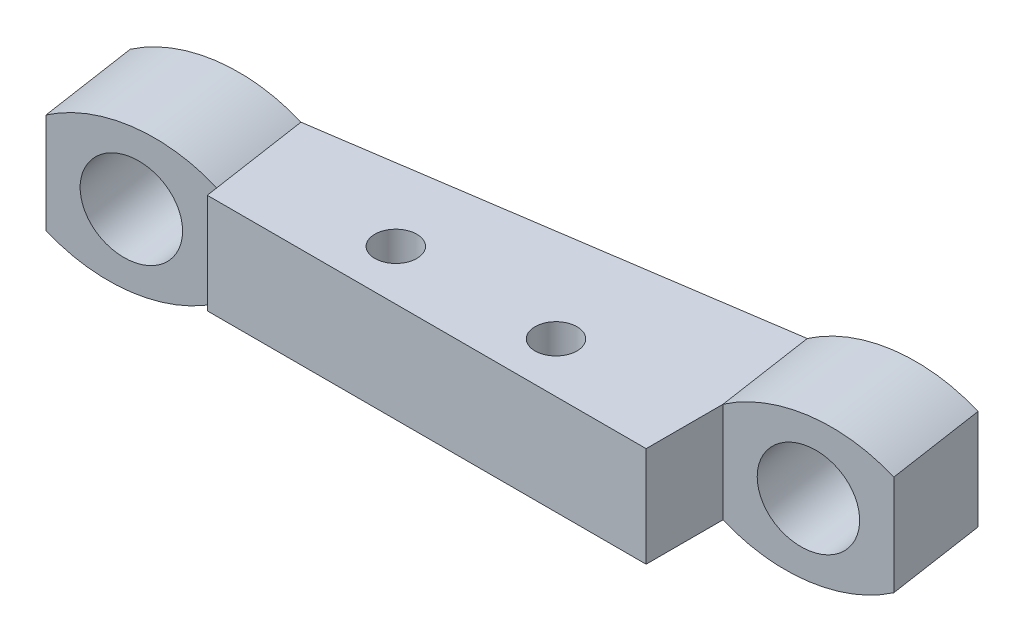
ISO-10303-21;
HEADER;
FILE_DESCRIPTION(('STEP AP214'),'2;1');
FILE_NAME('part.step','',(''),(''),'','','');
FILE_SCHEMA(('AUTOMOTIVE_DESIGN { 1 0 10303 214 1 1 1 1 }'));
ENDSEC;
DATA;
#1=APPLICATION_CONTEXT('core data for automotive mechanical design processes');
#2=APPLICATION_PROTOCOL_DEFINITION('international standard','automotive_design',2000,#1);
#3=PRODUCT_CONTEXT('',#1,'mechanical');
#4=PRODUCT('Part','Part','',(#3));
#5=PRODUCT_RELATED_PRODUCT_CATEGORY('part','',(#4));
#6=PRODUCT_DEFINITION_FORMATION('','',#4);
#7=PRODUCT_DEFINITION_CONTEXT('part definition',#1,'design');
#8=PRODUCT_DEFINITION('design','',#6,#7);
#9=PRODUCT_DEFINITION_SHAPE('','',#8);
#10=(LENGTH_UNIT() NAMED_UNIT(*) SI_UNIT(.MILLI.,.METRE.));
#11=(NAMED_UNIT(*) PLANE_ANGLE_UNIT() SI_UNIT($,.RADIAN.));
#12=(NAMED_UNIT(*) SI_UNIT($,.STERADIAN.) SOLID_ANGLE_UNIT());
#13=UNCERTAINTY_MEASURE_WITH_UNIT(LENGTH_MEASURE(1.E-05),#10,'distance_accuracy_value','');
#14=(GEOMETRIC_REPRESENTATION_CONTEXT(3) GLOBAL_UNCERTAINTY_ASSIGNED_CONTEXT((#13)) GLOBAL_UNIT_ASSIGNED_CONTEXT((#10,
#11,#12)) REPRESENTATION_CONTEXT('',''));
#15=CARTESIAN_POINT('',(0.,0.,0.));
#16=DIRECTION('',(0.,0.,1.));
#17=DIRECTION('',(1.,0.,0.));
#18=AXIS2_PLACEMENT_3D('',#15,#16,#17);
#19=CARTESIAN_POINT('',(23.478094111296,5.,-7.68568542574215));
#20=DIRECTION('',(-0.147809411129604,0.,-0.989015863361918));
#21=DIRECTION('',(-0.989015863361918,0.,0.147809411129604));
#22=AXIS2_PLACEMENT_3D('',#19,#20,#21);
#23=PLANE('',#22);
#24=CARTESIAN_POINT('',(30.8957130865104,0.,-8.79425600921418));
#25=DIRECTION('',(-0.147809411129604,0.,-0.989015863361918));
#26=DIRECTION('',(-0.989015863361918,0.,0.147809411129604));
#27=AXIS2_PLACEMENT_3D('',#24,#25,#26);
#28=CIRCLE('',#27,4.5);
#29=CARTESIAN_POINT('',(26.4451417013818,0.,-8.12911365913096));
#30=VERTEX_POINT('',#29);
#31=EDGE_CURVE('E183',#30,#30,#28,.T.);
#32=ORIENTED_EDGE('',*,*,#31,.T.);
#33=EDGE_LOOP('',(#32));
#34=FACE_BOUND('',#33,.T.);
#35=DIRECTION('',(0.,-1.,0.));
#36=VECTOR('',#35,1.);
#37=CARTESIAN_POINT('',(23.478094111296,5.,-7.68568542574215));
#38=LINE('',#37,#36);
#39=CARTESIAN_POINT('',(23.478094111296,5.,-7.68568542574215));
#40=VERTEX_POINT('',#39);
#41=CARTESIAN_POINT('',(23.478094111296,-5.,-7.68568542574215));
#42=VERTEX_POINT('',#41);
#43=EDGE_CURVE('E117',#40,#42,#38,.T.);
#44=ORIENTED_EDGE('',*,*,#43,.T.);
#45=CARTESIAN_POINT('',(30.8957130865104,6.82159041753689,-8.79425600921418));
#46=DIRECTION('',(-0.147809411129604,0.,-0.989015863361918));
#47=DIRECTION('',(0.989015863361918,0.,-0.147809411129604));
#48=AXIS2_PLACEMENT_3D('',#45,#46,#47);
#49=CIRCLE('',#48,14.);
#50=CARTESIAN_POINT('',(38.3133320617248,-5.,-9.90282659268621));
#51=VERTEX_POINT('',#50);
#52=EDGE_CURVE('E177',#51,#42,#49,.T.);
#53=ORIENTED_EDGE('',*,*,#52,.F.);
#54=DIRECTION('',(0.,-1.,0.));
#55=VECTOR('',#54,1.);
#56=CARTESIAN_POINT('',(38.3133320617248,5.,-9.90282659268621));
#57=LINE('',#56,#55);
#58=CARTESIAN_POINT('',(38.3133320617248,5.,-9.90282659268621));
#59=VERTEX_POINT('',#58);
#60=EDGE_CURVE('E172',#59,#51,#57,.T.);
#61=ORIENTED_EDGE('',*,*,#60,.F.);
#62=CARTESIAN_POINT('',(30.8957130865104,-6.82159041753689,-8.79425600921418));
#63=DIRECTION('',(-0.147809411129604,0.,-0.989015863361918));
#64=DIRECTION('',(-0.989015863361918,0.,0.147809411129604));
#65=AXIS2_PLACEMENT_3D('',#62,#63,#64);
#66=CIRCLE('',#65,14.);
#67=EDGE_CURVE('E186',#40,#59,#66,.T.);
#68=ORIENTED_EDGE('',*,*,#67,.F.);
#69=EDGE_LOOP('',(#44,#53,#61,#68));
#70=FACE_BOUND('',#69,.T.);
#71=ADVANCED_FACE('F32',(#34,#70),#23,.F.);
#72=CARTESIAN_POINT('',(22.,5.,0.));
#73=DIRECTION('',(0.,0.,-1.));
#74=DIRECTION('',(-1.,0.,0.));
#75=AXIS2_PLACEMENT_3D('',#72,#73,#74);
#76=PLANE('',#75);
#77=DIRECTION('',(1.,0.,0.));
#78=VECTOR('',#77,1.);
#79=CARTESIAN_POINT('',(22.,-5.,0.));
#80=LINE('',#79,#78);
#81=CARTESIAN_POINT('',(-20.3560389851597,-5.,0.));
#82=VERTEX_POINT('',#81);
#83=CARTESIAN_POINT('',(23.4780941112961,-5.,0.));
#84=VERTEX_POINT('',#83);
#85=EDGE_CURVE('E124',#82,#84,#80,.T.);
#86=ORIENTED_EDGE('',*,*,#85,.T.);
#87=DIRECTION('',(0.,1.,0.));
#88=VECTOR('',#87,1.);
#89=CARTESIAN_POINT('',(23.4780941112961,-5.,0.));
#90=LINE('',#89,#88);
#91=CARTESIAN_POINT('',(23.4780941112961,5.,0.));
#92=VERTEX_POINT('',#91);
#93=EDGE_CURVE('E106',#84,#92,#90,.T.);
#94=ORIENTED_EDGE('',*,*,#93,.T.);
#95=DIRECTION('',(1.,0.,0.));
#96=VECTOR('',#95,1.);
#97=CARTESIAN_POINT('',(22.,5.,0.));
#98=LINE('',#97,#96);
#99=CARTESIAN_POINT('',(-20.3560389851597,5.,0.));
#100=VERTEX_POINT('',#99);
#101=EDGE_CURVE('E42',#100,#92,#98,.T.);
#102=ORIENTED_EDGE('',*,*,#101,.F.);
#103=DIRECTION('',(0.,1.,0.));
#104=VECTOR('',#103,1.);
#105=CARTESIAN_POINT('',(-20.3560389851597,-5.,0.));
#106=LINE('',#105,#104);
#107=EDGE_CURVE('E130',#82,#100,#106,.T.);
#108=ORIENTED_EDGE('',*,*,#107,.F.);
#109=EDGE_LOOP('',(#86,#94,#102,#108));
#110=FACE_BOUND('',#109,.T.);
#111=ADVANCED_FACE('F34',(#110),#76,.F.);
#112=CARTESIAN_POINT('',(-22.,5.,-11.));
#113=DIRECTION('',(0.147809411129604,0.,0.989015863361918));
#114=DIRECTION('',(0.989015863361918,0.,-0.147809411129604));
#115=AXIS2_PLACEMENT_3D('',#112,#113,#114);
#116=PLANE('',#115);
#117=DIRECTION('',(-0.989015863361918,0.,0.147809411129604));
#118=VECTOR('',#117,1.);
#119=CARTESIAN_POINT('',(-22.,-5.,-11.));
#120=LINE('',#119,#118);
#121=CARTESIAN_POINT('',(22.,-5.,-17.5758440593613));
#122=VERTEX_POINT('',#121);
#123=CARTESIAN_POINT('',(-22.,-5.,-11.));
#124=VERTEX_POINT('',#123);
#125=EDGE_CURVE('E36',#122,#124,#120,.T.);
#126=ORIENTED_EDGE('',*,*,#125,.T.);
#127=CARTESIAN_POINT('',(-29.4176189752144,6.82159041753689,-9.89142941652796));
#128=DIRECTION('',(-0.147809411129604,0.,-0.989015863361918));
#129=DIRECTION('',(-0.989015863361918,0.,0.147809411129604));
#130=AXIS2_PLACEMENT_3D('',#127,#128,#129);
#131=CIRCLE('',#130,14.);
#132=CARTESIAN_POINT('',(-36.8352379504288,-4.99999999999998,-8.78285883305593));
#133=VERTEX_POINT('',#132);
#134=EDGE_CURVE('E150',#124,#133,#131,.T.);
#135=ORIENTED_EDGE('',*,*,#134,.T.);
#136=DIRECTION('',(0.,1.,0.));
#137=VECTOR('',#136,1.);
#138=CARTESIAN_POINT('',(-36.8352379504288,5.,-8.78285883305593));
#139=LINE('',#138,#137);
#140=CARTESIAN_POINT('',(-36.8352379504288,5.,-8.78285883305593));
#141=VERTEX_POINT('',#140);
#142=EDGE_CURVE('E147',#133,#141,#139,.T.);
#143=ORIENTED_EDGE('',*,*,#142,.T.);
#144=CARTESIAN_POINT('',(-29.4176189752144,-6.82159041753689,-9.89142941652796));
#145=DIRECTION('',(-0.147809411129604,0.,-0.989015863361918));
#146=DIRECTION('',(0.989015863361918,0.,-0.147809411129604));
#147=AXIS2_PLACEMENT_3D('',#144,#145,#146);
#148=CIRCLE('',#147,14.);
#149=CARTESIAN_POINT('',(-22.,4.99999999999999,-11.));
#150=VERTEX_POINT('',#149);
#151=EDGE_CURVE('E144',#141,#150,#148,.T.);
#152=ORIENTED_EDGE('',*,*,#151,.T.);
#153=DIRECTION('',(-0.989015863361918,0.,0.147809411129604));
#154=VECTOR('',#153,1.);
#155=CARTESIAN_POINT('',(-22.,5.,-11.));
#156=LINE('',#155,#154);
#157=CARTESIAN_POINT('',(22.,5.,-17.5758440593613));
#158=VERTEX_POINT('',#157);
#159=EDGE_CURVE('E11',#158,#150,#156,.T.);
#160=ORIENTED_EDGE('',*,*,#159,.F.);
#161=CARTESIAN_POINT('',(29.4176189752144,-6.82159041753689,-18.6844146428334));
#162=DIRECTION('',(-0.147809411129604,0.,-0.989015863361918));
#163=DIRECTION('',(-0.989015863361918,0.,0.147809411129604));
#164=AXIS2_PLACEMENT_3D('',#161,#162,#163);
#165=CIRCLE('',#164,14.);
#166=CARTESIAN_POINT('',(36.8352379504288,5.,-19.7929852263054));
#167=VERTEX_POINT('',#166);
#168=EDGE_CURVE('E178',#158,#167,#165,.T.);
#169=ORIENTED_EDGE('',*,*,#168,.T.);
#170=DIRECTION('',(0.,-1.,0.));
#171=VECTOR('',#170,1.);
#172=CARTESIAN_POINT('',(36.8352379504288,5.,-19.7929852263054));
#173=LINE('',#172,#171);
#174=CARTESIAN_POINT('',(36.8352379504288,-5.,-19.7929852263054));
#175=VERTEX_POINT('',#174);
#176=EDGE_CURVE('E174',#167,#175,#173,.T.);
#177=ORIENTED_EDGE('',*,*,#176,.T.);
#178=CARTESIAN_POINT('',(29.4176189752144,6.82159041753689,-18.6844146428334));
#179=DIRECTION('',(-0.147809411129604,0.,-0.989015863361918));
#180=DIRECTION('',(0.989015863361918,0.,-0.147809411129604));
#181=AXIS2_PLACEMENT_3D('',#178,#179,#180);
#182=CIRCLE('',#181,14.);
#183=EDGE_CURVE('E180',#175,#122,#182,.T.);
#184=ORIENTED_EDGE('',*,*,#183,.T.);
#185=EDGE_LOOP('',(#126,#135,#143,#152,#160,#169,#177,#184));
#186=FACE_BOUND('',#185,.T.);
#187=CARTESIAN_POINT('',(-29.4176189752144,0.,-9.89142941652796));
#188=DIRECTION('',(-0.147809411129604,0.,-0.989015863361918));
#189=DIRECTION('',(0.989015863361918,0.,-0.147809411129604));
#190=AXIS2_PLACEMENT_3D('',#187,#188,#189);
#191=CIRCLE('',#190,4.50000000000001);
#192=CARTESIAN_POINT('',(-24.9670475900857,0.,-10.5565717666112));
#193=VERTEX_POINT('',#192);
#194=EDGE_CURVE('E161',#193,#193,#191,.T.);
#195=ORIENTED_EDGE('',*,*,#194,.F.);
#196=EDGE_LOOP('',(#195));
#197=FACE_BOUND('',#196,.T.);
#198=CARTESIAN_POINT('',(29.4176189752144,0.,-18.6844146428334));
#199=DIRECTION('',(-0.147809411129604,0.,-0.989015863361918));
#200=DIRECTION('',(-0.989015863361918,0.,0.147809411129604));
#201=AXIS2_PLACEMENT_3D('',#198,#199,#200);
#202=CIRCLE('',#201,4.5);
#203=CARTESIAN_POINT('',(24.9670475900857,0.,-18.0192722927501));
#204=VERTEX_POINT('',#203);
#205=EDGE_CURVE('E190',#204,#204,#202,.T.);
#206=ORIENTED_EDGE('',*,*,#205,.F.);
#207=EDGE_LOOP('',(#206));
#208=FACE_BOUND('',#207,.T.);
#209=ADVANCED_FACE('F230',(#186,#197,#208),#116,.F.);
#210=CARTESIAN_POINT('',(0.,5.,0.));
#211=DIRECTION('',(0.,-1.,0.));
#212=DIRECTION('',(0.,0.,-1.));
#213=AXIS2_PLACEMENT_3D('',#210,#211,#212);
#214=PLANE('',#213);
#215=CARTESIAN_POINT('',(-6.52190588870396,5.,-4.99999999999999));
#216=DIRECTION('',(0.,1.,0.));
#217=DIRECTION('',(0.,0.,1.));
#218=AXIS2_PLACEMENT_3D('',#215,#216,#217);
#219=CIRCLE('',#218,2.1);
#220=CARTESIAN_POINT('',(-6.52190588870396,5.,-2.89999999999999));
#221=VERTEX_POINT('',#220);
#222=EDGE_CURVE('E212',#221,#221,#219,.T.);
#223=ORIENTED_EDGE('',*,*,#222,.F.);
#224=EDGE_LOOP('',(#223));
#225=FACE_BOUND('',#224,.T.);
#226=CARTESIAN_POINT('',(9.47809411129604,5.,-4.99999999999999));
#227=DIRECTION('',(0.,1.,0.));
#228=DIRECTION('',(0.,0.,1.));
#229=AXIS2_PLACEMENT_3D('',#226,#227,#228);
#230=CIRCLE('',#229,2.1);
#231=CARTESIAN_POINT('',(9.47809411129604,5.,-2.89999999999999));
#232=VERTEX_POINT('',#231);
#233=EDGE_CURVE('E206',#232,#232,#230,.T.);
#234=ORIENTED_EDGE('',*,*,#233,.F.);
#235=EDGE_LOOP('',(#234));
#236=FACE_BOUND('',#235,.T.);
#237=ORIENTED_EDGE('',*,*,#101,.T.);
#238=DIRECTION('',(0.,0.,1.));
#239=VECTOR('',#238,1.);
#240=CARTESIAN_POINT('',(23.4780941112961,5.,0.));
#241=LINE('',#240,#239);
#242=EDGE_CURVE('E112',#40,#92,#241,.T.);
#243=ORIENTED_EDGE('',*,*,#242,.F.);
#244=DIRECTION('',(-0.147809411129604,0.,-0.989015863361918));
#245=VECTOR('',#244,1.);
#246=CARTESIAN_POINT('',(22.,5.,-17.5758440593613));
#247=LINE('',#246,#245);
#248=EDGE_CURVE('E164',#40,#158,#247,.T.);
#249=ORIENTED_EDGE('',*,*,#248,.T.);
#250=ORIENTED_EDGE('',*,*,#159,.T.);
#251=DIRECTION('',(-0.147809411129604,0.,-0.989015863361918));
#252=VECTOR('',#251,1.);
#253=CARTESIAN_POINT('',(-20.521905888704,4.99999999999999,-1.10984136638081));
#254=LINE('',#253,#252);
#255=CARTESIAN_POINT('',(-20.521905888704,4.99999999999999,-1.10984136638081));
#256=VERTEX_POINT('',#255);
#257=EDGE_CURVE('E134',#256,#150,#254,.T.);
#258=ORIENTED_EDGE('',*,*,#257,.F.);
#259=DIRECTION('',(-0.147809411129603,0.,-0.989015863361918));
#260=VECTOR('',#259,1.);
#261=CARTESIAN_POINT('',(-20.521905888704,5.,-1.10984136638081));
#262=LINE('',#261,#260);
#263=EDGE_CURVE('E200',#100,#256,#262,.T.);
#264=ORIENTED_EDGE('',*,*,#263,.F.);
#265=EDGE_LOOP('',(#237,#243,#249,#250,#258,#264));
#266=FACE_BOUND('',#265,.T.);
#267=ADVANCED_FACE('F227',(#225,#236,#266),#214,.F.);
#268=CARTESIAN_POINT('',(0.,-5.,0.));
#269=DIRECTION('',(0.,-1.,0.));
#270=DIRECTION('',(0.,0.,-1.));
#271=AXIS2_PLACEMENT_3D('',#268,#269,#270);
#272=PLANE('',#271);
#273=CARTESIAN_POINT('',(-6.52190588870396,-5.,-4.99999999999999));
#274=DIRECTION('',(0.,1.,0.));
#275=DIRECTION('',(0.,0.,1.));
#276=AXIS2_PLACEMENT_3D('',#273,#274,#275);
#277=CIRCLE('',#276,2.1);
#278=CARTESIAN_POINT('',(-6.52190588870396,-5.,-2.89999999999999));
#279=VERTEX_POINT('',#278);
#280=EDGE_CURVE('E209',#279,#279,#277,.T.);
#281=ORIENTED_EDGE('',*,*,#280,.T.);
#282=EDGE_LOOP('',(#281));
#283=FACE_BOUND('',#282,.T.);
#284=CARTESIAN_POINT('',(9.47809411129604,-5.,-4.99999999999999));
#285=DIRECTION('',(0.,1.,0.));
#286=DIRECTION('',(0.,0.,1.));
#287=AXIS2_PLACEMENT_3D('',#284,#285,#286);
#288=CIRCLE('',#287,2.1);
#289=CARTESIAN_POINT('',(9.47809411129604,-5.,-2.89999999999999));
#290=VERTEX_POINT('',#289);
#291=EDGE_CURVE('E204',#290,#290,#288,.T.);
#292=ORIENTED_EDGE('',*,*,#291,.T.);
#293=EDGE_LOOP('',(#292));
#294=FACE_BOUND('',#293,.T.);
#295=DIRECTION('',(0.,0.,1.));
#296=VECTOR('',#295,1.);
#297=CARTESIAN_POINT('',(23.4780941112961,-5.,0.));
#298=LINE('',#297,#296);
#299=EDGE_CURVE('E109',#42,#84,#298,.T.);
#300=ORIENTED_EDGE('',*,*,#299,.T.);
#301=ORIENTED_EDGE('',*,*,#85,.F.);
#302=DIRECTION('',(-0.147809411129603,0.,-0.989015863361918));
#303=VECTOR('',#302,1.);
#304=CARTESIAN_POINT('',(-20.521905888704,-5.,-1.10984136638081));
#305=LINE('',#304,#303);
#306=CARTESIAN_POINT('',(-20.521905888704,-5.,-1.10984136638081));
#307=VERTEX_POINT('',#306);
#308=EDGE_CURVE('E197',#82,#307,#305,.T.);
#309=ORIENTED_EDGE('',*,*,#308,.T.);
#310=DIRECTION('',(-0.147809411129604,0.,-0.989015863361918));
#311=VECTOR('',#310,1.);
#312=CARTESIAN_POINT('',(-20.521905888704,-5.,-1.10984136638081));
#313=LINE('',#312,#311);
#314=EDGE_CURVE('E131',#307,#124,#313,.T.);
#315=ORIENTED_EDGE('',*,*,#314,.T.);
#316=ORIENTED_EDGE('',*,*,#125,.F.);
#317=DIRECTION('',(-0.147809411129604,0.,-0.989015863361918));
#318=VECTOR('',#317,1.);
#319=CARTESIAN_POINT('',(22.,-5.,-17.5758440593613));
#320=LINE('',#319,#318);
#321=EDGE_CURVE('E126',#42,#122,#320,.T.);
#322=ORIENTED_EDGE('',*,*,#321,.F.);
#323=EDGE_LOOP('',(#300,#301,#309,#315,#316,#322));
#324=FACE_BOUND('',#323,.T.);
#325=ADVANCED_FACE('F122',(#283,#294,#324),#272,.T.);
#326=CARTESIAN_POINT('',(-27.9395248639183,6.82159041753689,-0.00127078290878234));
#327=DIRECTION('',(-0.147809411129604,0.,-0.989015863361918));
#328=DIRECTION('',(-0.989015863361918,0.,0.147809411129604));
#329=AXIS2_PLACEMENT_3D('',#326,#327,#328);
#330=PLANE('',#329);
#331=CARTESIAN_POINT('',(-27.9395248639183,6.82159041753689,-0.00127078290878234));
#332=DIRECTION('',(-0.147809411129604,0.,-0.989015863361918));
#333=DIRECTION('',(-0.989015863361918,0.,0.147809411129604));
#334=AXIS2_PLACEMENT_3D('',#331,#332,#333);
#335=CIRCLE('',#334,14.);
#336=CARTESIAN_POINT('',(-35.3571438391327,-4.99999999999998,1.10729980056325));
#337=VERTEX_POINT('',#336);
#338=EDGE_CURVE('E146',#307,#337,#335,.T.);
#339=ORIENTED_EDGE('',*,*,#338,.F.);
#340=DIRECTION('',(0.,1.,0.));
#341=VECTOR('',#340,1.);
#342=CARTESIAN_POINT('',(-20.521905888704,-5.,-1.10984136638081));
#343=LINE('',#342,#341);
#344=EDGE_CURVE('E193',#307,#256,#343,.T.);
#345=ORIENTED_EDGE('',*,*,#344,.T.);
#346=CARTESIAN_POINT('',(-27.9395248639183,-6.82159041753689,-0.0012707829087806));
#347=DIRECTION('',(-0.147809411129604,0.,-0.989015863361918));
#348=DIRECTION('',(0.989015863361918,0.,-0.147809411129604));
#349=AXIS2_PLACEMENT_3D('',#346,#347,#348);
#350=CIRCLE('',#349,14.);
#351=CARTESIAN_POINT('',(-35.3571438391327,5.,1.10729980056325));
#352=VERTEX_POINT('',#351);
#353=EDGE_CURVE('E141',#352,#256,#350,.T.);
#354=ORIENTED_EDGE('',*,*,#353,.F.);
#355=DIRECTION('',(0.,1.,0.));
#356=VECTOR('',#355,1.);
#357=CARTESIAN_POINT('',(-35.3571438391327,5.,1.10729980056325));
#358=LINE('',#357,#356);
#359=EDGE_CURVE('E156',#337,#352,#358,.T.);
#360=ORIENTED_EDGE('',*,*,#359,.F.);
#361=EDGE_LOOP('',(#339,#345,#354,#360));
#362=FACE_BOUND('',#361,.T.);
#363=CARTESIAN_POINT('',(-27.9395248639183,0.,-0.00127078290878234));
#364=DIRECTION('',(-0.147809411129604,0.,-0.989015863361918));
#365=DIRECTION('',(0.989015863361918,0.,-0.147809411129604));
#366=AXIS2_PLACEMENT_3D('',#363,#364,#365);
#367=CIRCLE('',#366,4.50000000000001);
#368=CARTESIAN_POINT('',(-23.4889534787897,0.,-0.666413132992003));
#369=VERTEX_POINT('',#368);
#370=EDGE_CURVE('E153',#369,#369,#367,.T.);
#371=ORIENTED_EDGE('',*,*,#370,.T.);
#372=EDGE_LOOP('',(#371));
#373=FACE_BOUND('',#372,.T.);
#374=ADVANCED_FACE('F242',(#362,#373),#330,.F.);
#375=CARTESIAN_POINT('',(-27.9395248639183,6.82159041753689,-0.00127078290878234));
#376=DIRECTION('',(-0.147809411129604,0.,-0.989015863361918));
#377=DIRECTION('',(-0.989015863361918,0.,0.147809411129604));
#378=AXIS2_PLACEMENT_3D('',#375,#376,#377);
#379=CYLINDRICAL_SURFACE('',#378,14.);
#380=ORIENTED_EDGE('',*,*,#134,.F.);
#381=ORIENTED_EDGE('',*,*,#314,.F.);
#382=ORIENTED_EDGE('',*,*,#338,.T.);
#383=DIRECTION('',(-0.147809411129604,0.,-0.989015863361918));
#384=VECTOR('',#383,1.);
#385=CARTESIAN_POINT('',(-35.3571438391327,-4.99999999999998,1.10729980056325));
#386=LINE('',#385,#384);
#387=EDGE_CURVE('E138',#337,#133,#386,.T.);
#388=ORIENTED_EDGE('',*,*,#387,.T.);
#389=EDGE_LOOP('',(#380,#381,#382,#388));
#390=FACE_BOUND('',#389,.T.);
#391=ADVANCED_FACE('F253',(#390),#379,.T.);
#392=CARTESIAN_POINT('',(-27.9395248639183,-6.82159041753689,-0.0012707829087806));
#393=DIRECTION('',(-0.147809411129604,0.,-0.989015863361918));
#394=DIRECTION('',(-0.989015863361918,0.,0.147809411129604));
#395=AXIS2_PLACEMENT_3D('',#392,#393,#394);
#396=CYLINDRICAL_SURFACE('',#395,14.);
#397=ORIENTED_EDGE('',*,*,#151,.F.);
#398=DIRECTION('',(-0.147809411129604,0.,-0.989015863361918));
#399=VECTOR('',#398,1.);
#400=CARTESIAN_POINT('',(-35.3571438391327,5.,1.10729980056325));
#401=LINE('',#400,#399);
#402=EDGE_CURVE('E140',#352,#141,#401,.T.);
#403=ORIENTED_EDGE('',*,*,#402,.F.);
#404=ORIENTED_EDGE('',*,*,#353,.T.);
#405=ORIENTED_EDGE('',*,*,#257,.T.);
#406=EDGE_LOOP('',(#397,#403,#404,#405));
#407=FACE_BOUND('',#406,.T.);
#408=ADVANCED_FACE('F248',(#407),#396,.T.);
#409=CARTESIAN_POINT('',(-35.3571438391327,5.,1.10729980056325));
#410=DIRECTION('',(-0.989015863361918,0.,0.147809411129604));
#411=DIRECTION('',(0.147809411129604,0.,0.989015863361918));
#412=AXIS2_PLACEMENT_3D('',#409,#410,#411);
#413=PLANE('',#412);
#414=ORIENTED_EDGE('',*,*,#142,.F.);
#415=ORIENTED_EDGE('',*,*,#387,.F.);
#416=ORIENTED_EDGE('',*,*,#359,.T.);
#417=ORIENTED_EDGE('',*,*,#402,.T.);
#418=EDGE_LOOP('',(#414,#415,#416,#417));
#419=FACE_BOUND('',#418,.T.);
#420=ADVANCED_FACE('F251',(#419),#413,.T.);
#421=CARTESIAN_POINT('',(-27.9395248639183,0.,-0.00127078290878234));
#422=DIRECTION('',(-0.147809411129604,0.,-0.989015863361918));
#423=DIRECTION('',(-0.989015863361918,0.,0.147809411129604));
#424=AXIS2_PLACEMENT_3D('',#421,#422,#423);
#425=CYLINDRICAL_SURFACE('',#424,4.50000000000001);
#426=ORIENTED_EDGE('',*,*,#370,.F.);
#427=EDGE_LOOP('',(#426));
#428=FACE_BOUND('',#427,.T.);
#429=ORIENTED_EDGE('',*,*,#194,.T.);
#430=EDGE_LOOP('',(#429));
#431=FACE_BOUND('',#430,.T.);
#432=ADVANCED_FACE('F286',(#428,#431),#425,.F.);
#433=CARTESIAN_POINT('',(30.8957130865104,6.82159041753689,-8.79425600921418));
#434=DIRECTION('',(-0.147809411129604,0.,-0.989015863361918));
#435=DIRECTION('',(-0.989015863361918,0.,0.147809411129604));
#436=AXIS2_PLACEMENT_3D('',#433,#434,#435);
#437=CYLINDRICAL_SURFACE('',#436,14.);
#438=ORIENTED_EDGE('',*,*,#183,.F.);
#439=DIRECTION('',(-0.147809411129604,0.,-0.989015863361918));
#440=VECTOR('',#439,1.);
#441=CARTESIAN_POINT('',(38.3133320617248,-5.,-9.90282659268621));
#442=LINE('',#441,#440);
#443=EDGE_CURVE('E168',#51,#175,#442,.T.);
#444=ORIENTED_EDGE('',*,*,#443,.F.);
#445=ORIENTED_EDGE('',*,*,#52,.T.);
#446=ORIENTED_EDGE('',*,*,#321,.T.);
#447=EDGE_LOOP('',(#438,#444,#445,#446));
#448=FACE_BOUND('',#447,.T.);
#449=ADVANCED_FACE('F258',(#448),#437,.T.);
#450=CARTESIAN_POINT('',(38.3133320617248,5.,-9.90282659268621));
#451=DIRECTION('',(0.989015863361918,0.,-0.147809411129604));
#452=DIRECTION('',(-0.147809411129604,0.,-0.989015863361918));
#453=AXIS2_PLACEMENT_3D('',#450,#451,#452);
#454=PLANE('',#453);
#455=ORIENTED_EDGE('',*,*,#176,.F.);
#456=DIRECTION('',(-0.147809411129604,0.,-0.989015863361918));
#457=VECTOR('',#456,1.);
#458=CARTESIAN_POINT('',(38.3133320617248,5.,-9.90282659268621));
#459=LINE('',#458,#457);
#460=EDGE_CURVE('E170',#59,#167,#459,.T.);
#461=ORIENTED_EDGE('',*,*,#460,.F.);
#462=ORIENTED_EDGE('',*,*,#60,.T.);
#463=ORIENTED_EDGE('',*,*,#443,.T.);
#464=EDGE_LOOP('',(#455,#461,#462,#463));
#465=FACE_BOUND('',#464,.T.);
#466=ADVANCED_FACE('F264',(#465),#454,.T.);
#467=CARTESIAN_POINT('',(30.8957130865104,-6.82159041753689,-8.79425600921418));
#468=DIRECTION('',(-0.147809411129604,0.,-0.989015863361918));
#469=DIRECTION('',(-0.989015863361918,0.,0.147809411129604));
#470=AXIS2_PLACEMENT_3D('',#467,#468,#469);
#471=CYLINDRICAL_SURFACE('',#470,14.);
#472=ORIENTED_EDGE('',*,*,#168,.F.);
#473=ORIENTED_EDGE('',*,*,#248,.F.);
#474=ORIENTED_EDGE('',*,*,#67,.T.);
#475=ORIENTED_EDGE('',*,*,#460,.T.);
#476=EDGE_LOOP('',(#472,#473,#474,#475));
#477=FACE_BOUND('',#476,.T.);
#478=ADVANCED_FACE('F267',(#477),#471,.T.);
#479=CARTESIAN_POINT('',(30.8957130865104,0.,-8.79425600921418));
#480=DIRECTION('',(-0.147809411129604,0.,-0.989015863361918));
#481=DIRECTION('',(-0.989015863361918,0.,0.147809411129604));
#482=AXIS2_PLACEMENT_3D('',#479,#480,#481);
#483=CYLINDRICAL_SURFACE('',#482,4.5);
#484=ORIENTED_EDGE('',*,*,#31,.F.);
#485=EDGE_LOOP('',(#484));
#486=FACE_BOUND('',#485,.T.);
#487=ORIENTED_EDGE('',*,*,#205,.T.);
#488=EDGE_LOOP('',(#487));
#489=FACE_BOUND('',#488,.T.);
#490=ADVANCED_FACE('F269',(#486,#489),#483,.F.);
#491=CARTESIAN_POINT('',(-20.521905888704,-5.,-1.10984136638081));
#492=DIRECTION('',(0.989015863361918,0.,-0.147809411129603));
#493=DIRECTION('',(-0.147809411129603,0.,-0.989015863361918));
#494=AXIS2_PLACEMENT_3D('',#491,#492,#493);
#495=PLANE('',#494);
#496=ORIENTED_EDGE('',*,*,#263,.T.);
#497=ORIENTED_EDGE('',*,*,#344,.F.);
#498=ORIENTED_EDGE('',*,*,#308,.F.);
#499=ORIENTED_EDGE('',*,*,#107,.T.);
#500=EDGE_LOOP('',(#496,#497,#498,#499));
#501=FACE_BOUND('',#500,.T.);
#502=ADVANCED_FACE('F238',(#501),#495,.F.);
#503=CARTESIAN_POINT('',(23.4780941112961,-5.,0.));
#504=DIRECTION('',(-1.,0.,0.));
#505=DIRECTION('',(0.,0.,1.));
#506=AXIS2_PLACEMENT_3D('',#503,#504,#505);
#507=PLANE('',#506);
#508=ORIENTED_EDGE('',*,*,#242,.T.);
#509=ORIENTED_EDGE('',*,*,#93,.F.);
#510=ORIENTED_EDGE('',*,*,#299,.F.);
#511=ORIENTED_EDGE('',*,*,#43,.F.);
#512=EDGE_LOOP('',(#508,#509,#510,#511));
#513=FACE_BOUND('',#512,.T.);
#514=ADVANCED_FACE('F108',(#513),#507,.F.);
#515=CARTESIAN_POINT('',(9.47809411129604,-5.,-4.99999999999999));
#516=DIRECTION('',(0.,1.,0.));
#517=DIRECTION('',(0.,0.,1.));
#518=AXIS2_PLACEMENT_3D('',#515,#516,#517);
#519=CYLINDRICAL_SURFACE('',#518,2.1);
#520=ORIENTED_EDGE('',*,*,#291,.F.);
#521=EDGE_LOOP('',(#520));
#522=FACE_BOUND('',#521,.T.);
#523=ORIENTED_EDGE('',*,*,#233,.T.);
#524=EDGE_LOOP('',(#523));
#525=FACE_BOUND('',#524,.T.);
#526=ADVANCED_FACE('F223',(#522,#525),#519,.F.);
#527=CARTESIAN_POINT('',(-6.52190588870396,-5.,-4.99999999999999));
#528=DIRECTION('',(0.,1.,0.));
#529=DIRECTION('',(0.,0.,1.));
#530=AXIS2_PLACEMENT_3D('',#527,#528,#529);
#531=CYLINDRICAL_SURFACE('',#530,2.1);
#532=ORIENTED_EDGE('',*,*,#280,.F.);
#533=EDGE_LOOP('',(#532));
#534=FACE_BOUND('',#533,.T.);
#535=ORIENTED_EDGE('',*,*,#222,.T.);
#536=EDGE_LOOP('',(#535));
#537=FACE_BOUND('',#536,.T.);
#538=ADVANCED_FACE('F220',(#534,#537),#531,.F.);
#539=CLOSED_SHELL('',(#71,#111,#209,#267,#325,#374,#391,#408,#420,#432,#449,#466,#478,#490,#502,
#514,#526,#538));
#540=MANIFOLD_SOLID_BREP('B2',#539);
#541=ADVANCED_BREP_SHAPE_REPRESENTATION('',(#18,#540),#14);
#542=SHAPE_DEFINITION_REPRESENTATION(#9,#541);
ENDSEC;
END-ISO-10303-21;
